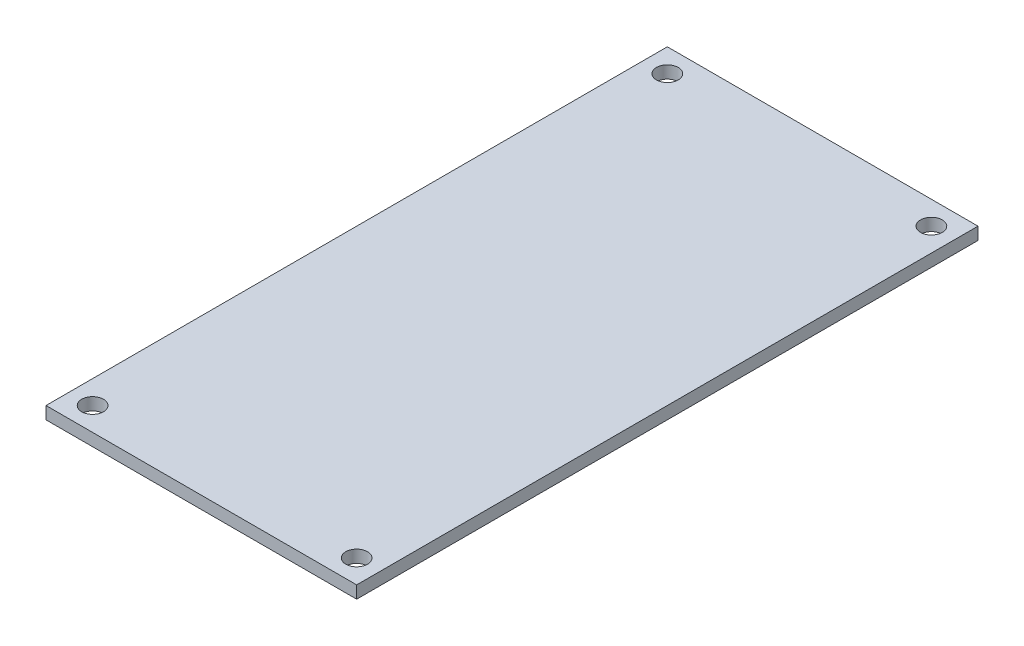
ISO-10303-21;
HEADER;
FILE_DESCRIPTION(('STEP AP214'),'2;1');
FILE_NAME('part.step','',(''),(''),'','','');
FILE_SCHEMA(('AUTOMOTIVE_DESIGN { 1 0 10303 214 1 1 1 1 }'));
ENDSEC;
DATA;
#1=APPLICATION_CONTEXT('core data for automotive mechanical design processes');
#2=APPLICATION_PROTOCOL_DEFINITION('international standard','automotive_design',2000,#1);
#3=PRODUCT_CONTEXT('',#1,'mechanical');
#4=PRODUCT('Part','Part','',(#3));
#5=PRODUCT_RELATED_PRODUCT_CATEGORY('part','',(#4));
#6=PRODUCT_DEFINITION_FORMATION('','',#4);
#7=PRODUCT_DEFINITION_CONTEXT('part definition',#1,'design');
#8=PRODUCT_DEFINITION('design','',#6,#7);
#9=PRODUCT_DEFINITION_SHAPE('','',#8);
#10=(LENGTH_UNIT() NAMED_UNIT(*) SI_UNIT(.MILLI.,.METRE.));
#11=(NAMED_UNIT(*) PLANE_ANGLE_UNIT() SI_UNIT($,.RADIAN.));
#12=(NAMED_UNIT(*) SI_UNIT($,.STERADIAN.) SOLID_ANGLE_UNIT());
#13=UNCERTAINTY_MEASURE_WITH_UNIT(LENGTH_MEASURE(1.E-05),#10,'distance_accuracy_value','');
#14=(GEOMETRIC_REPRESENTATION_CONTEXT(3) GLOBAL_UNCERTAINTY_ASSIGNED_CONTEXT((#13)) GLOBAL_UNIT_ASSIGNED_CONTEXT((#10,
#11,#12)) REPRESENTATION_CONTEXT('',''));
#15=CARTESIAN_POINT('',(0.,0.,0.));
#16=DIRECTION('',(0.,0.,1.));
#17=DIRECTION('',(1.,0.,0.));
#18=AXIS2_PLACEMENT_3D('',#15,#16,#17);
#19=CARTESIAN_POINT('',(0.,2.,0.));
#20=DIRECTION('',(0.,1.,0.));
#21=DIRECTION('',(0.,0.,1.));
#22=AXIS2_PLACEMENT_3D('',#19,#20,#21);
#23=PLANE('',#22);
#24=CARTESIAN_POINT('',(21.25,2.,46.25));
#25=DIRECTION('',(0.,1.,0.));
#26=DIRECTION('',(0.,0.,1.));
#27=AXIS2_PLACEMENT_3D('',#24,#25,#26);
#28=CIRCLE('',#27,1.75);
#29=CARTESIAN_POINT('',(21.25,2.,48.));
#30=VERTEX_POINT('',#29);
#31=EDGE_CURVE('E121',#30,#30,#28,.T.);
#32=ORIENTED_EDGE('',*,*,#31,.F.);
#33=EDGE_LOOP('',(#32));
#34=FACE_BOUND('',#33,.T.);
#35=CARTESIAN_POINT('',(-21.25,2.,-46.25));
#36=DIRECTION('',(0.,1.,0.));
#37=DIRECTION('',(0.,0.,1.));
#38=AXIS2_PLACEMENT_3D('',#35,#36,#37);
#39=CIRCLE('',#38,1.75);
#40=CARTESIAN_POINT('',(-21.25,2.,-44.5));
#41=VERTEX_POINT('',#40);
#42=EDGE_CURVE('E100',#41,#41,#39,.T.);
#43=ORIENTED_EDGE('',*,*,#42,.F.);
#44=EDGE_LOOP('',(#43));
#45=FACE_BOUND('',#44,.T.);
#46=DIRECTION('',(0.,0.,1.));
#47=VECTOR('',#46,1.);
#48=CARTESIAN_POINT('',(-25.,2.,50.));
#49=LINE('',#48,#47);
#50=CARTESIAN_POINT('',(-25.,2.,-50.));
#51=VERTEX_POINT('',#50);
#52=CARTESIAN_POINT('',(-25.,2.,50.));
#53=VERTEX_POINT('',#52);
#54=EDGE_CURVE('E85',#51,#53,#49,.T.);
#55=ORIENTED_EDGE('',*,*,#54,.T.);
#56=DIRECTION('',(1.,0.,0.));
#57=VECTOR('',#56,1.);
#58=CARTESIAN_POINT('',(25.,2.,50.));
#59=LINE('',#58,#57);
#60=CARTESIAN_POINT('',(25.,2.,50.));
#61=VERTEX_POINT('',#60);
#62=EDGE_CURVE('E80',#53,#61,#59,.T.);
#63=ORIENTED_EDGE('',*,*,#62,.T.);
#64=DIRECTION('',(0.,0.,-1.));
#65=VECTOR('',#64,1.);
#66=CARTESIAN_POINT('',(25.,2.,50.));
#67=LINE('',#66,#65);
#68=CARTESIAN_POINT('',(25.,2.,-50.));
#69=VERTEX_POINT('',#68);
#70=EDGE_CURVE('E83',#61,#69,#67,.T.);
#71=ORIENTED_EDGE('',*,*,#70,.T.);
#72=DIRECTION('',(-1.,0.,0.));
#73=VECTOR('',#72,1.);
#74=CARTESIAN_POINT('',(25.,2.,-50.));
#75=LINE('',#74,#73);
#76=EDGE_CURVE('E50',#69,#51,#75,.T.);
#77=ORIENTED_EDGE('',*,*,#76,.T.);
#78=EDGE_LOOP('',(#55,#63,#71,#77));
#79=FACE_BOUND('',#78,.T.);
#80=CARTESIAN_POINT('',(21.25,2.,-46.25));
#81=DIRECTION('',(0.,1.,0.));
#82=DIRECTION('',(0.,0.,-1.));
#83=AXIS2_PLACEMENT_3D('',#80,#81,#82);
#84=CIRCLE('',#83,1.75);
#85=CARTESIAN_POINT('',(21.25,2.,-48.));
#86=VERTEX_POINT('',#85);
#87=EDGE_CURVE('E115',#86,#86,#84,.T.);
#88=ORIENTED_EDGE('',*,*,#87,.F.);
#89=EDGE_LOOP('',(#88));
#90=FACE_BOUND('',#89,.T.);
#91=CARTESIAN_POINT('',(-21.25,2.,46.25));
#92=DIRECTION('',(0.,1.,0.));
#93=DIRECTION('',(0.,0.,-1.));
#94=AXIS2_PLACEMENT_3D('',#91,#92,#93);
#95=CIRCLE('',#94,1.75);
#96=CARTESIAN_POINT('',(-21.25,2.,44.5));
#97=VERTEX_POINT('',#96);
#98=EDGE_CURVE('E127',#97,#97,#95,.T.);
#99=ORIENTED_EDGE('',*,*,#98,.F.);
#100=EDGE_LOOP('',(#99));
#101=FACE_BOUND('',#100,.T.);
#102=ADVANCED_FACE('F33',(#34,#45,#79,#90,#101),#23,.T.);
#103=CARTESIAN_POINT('',(0.,0.,0.));
#104=DIRECTION('',(0.,1.,0.));
#105=DIRECTION('',(0.,0.,1.));
#106=AXIS2_PLACEMENT_3D('',#103,#104,#105);
#107=PLANE('',#106);
#108=DIRECTION('',(0.,0.,1.));
#109=VECTOR('',#108,1.);
#110=CARTESIAN_POINT('',(-25.,0.,50.));
#111=LINE('',#110,#109);
#112=CARTESIAN_POINT('',(-25.,0.,-50.));
#113=VERTEX_POINT('',#112);
#114=CARTESIAN_POINT('',(-25.,0.,50.));
#115=VERTEX_POINT('',#114);
#116=EDGE_CURVE('E97',#113,#115,#111,.T.);
#117=ORIENTED_EDGE('',*,*,#116,.F.);
#118=DIRECTION('',(-1.,0.,0.));
#119=VECTOR('',#118,1.);
#120=CARTESIAN_POINT('',(25.,0.,-50.));
#121=LINE('',#120,#119);
#122=CARTESIAN_POINT('',(25.,0.,-50.));
#123=VERTEX_POINT('',#122);
#124=EDGE_CURVE('E73',#123,#113,#121,.T.);
#125=ORIENTED_EDGE('',*,*,#124,.F.);
#126=DIRECTION('',(0.,0.,-1.));
#127=VECTOR('',#126,1.);
#128=CARTESIAN_POINT('',(25.,0.,50.));
#129=LINE('',#128,#127);
#130=CARTESIAN_POINT('',(25.,0.,50.));
#131=VERTEX_POINT('',#130);
#132=EDGE_CURVE('E67',#131,#123,#129,.T.);
#133=ORIENTED_EDGE('',*,*,#132,.F.);
#134=DIRECTION('',(1.,0.,0.));
#135=VECTOR('',#134,1.);
#136=CARTESIAN_POINT('',(25.,0.,50.));
#137=LINE('',#136,#135);
#138=EDGE_CURVE('E89',#115,#131,#137,.T.);
#139=ORIENTED_EDGE('',*,*,#138,.F.);
#140=EDGE_LOOP('',(#117,#125,#133,#139));
#141=FACE_BOUND('',#140,.T.);
#142=CARTESIAN_POINT('',(-21.25,0.,-46.25));
#143=DIRECTION('',(0.,1.,0.));
#144=DIRECTION('',(0.,0.,1.));
#145=AXIS2_PLACEMENT_3D('',#142,#143,#144);
#146=CIRCLE('',#145,1.75);
#147=CARTESIAN_POINT('',(-21.25,0.,-44.5));
#148=VERTEX_POINT('',#147);
#149=EDGE_CURVE('E112',#148,#148,#146,.T.);
#150=ORIENTED_EDGE('',*,*,#149,.T.);
#151=EDGE_LOOP('',(#150));
#152=FACE_BOUND('',#151,.T.);
#153=CARTESIAN_POINT('',(21.25,0.,-46.25));
#154=DIRECTION('',(0.,1.,0.));
#155=DIRECTION('',(0.,0.,-1.));
#156=AXIS2_PLACEMENT_3D('',#153,#154,#155);
#157=CIRCLE('',#156,1.75);
#158=CARTESIAN_POINT('',(21.25,0.,-48.));
#159=VERTEX_POINT('',#158);
#160=EDGE_CURVE('E118',#159,#159,#157,.T.);
#161=ORIENTED_EDGE('',*,*,#160,.T.);
#162=EDGE_LOOP('',(#161));
#163=FACE_BOUND('',#162,.T.);
#164=CARTESIAN_POINT('',(21.25,0.,46.25));
#165=DIRECTION('',(0.,1.,0.));
#166=DIRECTION('',(0.,0.,1.));
#167=AXIS2_PLACEMENT_3D('',#164,#165,#166);
#168=CIRCLE('',#167,1.75);
#169=CARTESIAN_POINT('',(21.25,0.,48.));
#170=VERTEX_POINT('',#169);
#171=EDGE_CURVE('E124',#170,#170,#168,.T.);
#172=ORIENTED_EDGE('',*,*,#171,.T.);
#173=EDGE_LOOP('',(#172));
#174=FACE_BOUND('',#173,.T.);
#175=CARTESIAN_POINT('',(-21.25,0.,46.25));
#176=DIRECTION('',(0.,1.,0.));
#177=DIRECTION('',(0.,0.,-1.));
#178=AXIS2_PLACEMENT_3D('',#175,#176,#177);
#179=CIRCLE('',#178,1.75);
#180=CARTESIAN_POINT('',(-21.25,0.,44.5));
#181=VERTEX_POINT('',#180);
#182=EDGE_CURVE('E130',#181,#181,#179,.T.);
#183=ORIENTED_EDGE('',*,*,#182,.T.);
#184=EDGE_LOOP('',(#183));
#185=FACE_BOUND('',#184,.T.);
#186=ADVANCED_FACE('F108',(#141,#152,#163,#174,#185),#107,.F.);
#187=CARTESIAN_POINT('',(-25.,2.,50.));
#188=DIRECTION('',(1.,0.,0.));
#189=DIRECTION('',(0.,0.,-1.));
#190=AXIS2_PLACEMENT_3D('',#187,#188,#189);
#191=PLANE('',#190);
#192=ORIENTED_EDGE('',*,*,#116,.T.);
#193=DIRECTION('',(0.,-1.,0.));
#194=VECTOR('',#193,1.);
#195=CARTESIAN_POINT('',(-25.,2.,50.));
#196=LINE('',#195,#194);
#197=EDGE_CURVE('E11',#53,#115,#196,.T.);
#198=ORIENTED_EDGE('',*,*,#197,.F.);
#199=ORIENTED_EDGE('',*,*,#54,.F.);
#200=DIRECTION('',(0.,-1.,0.));
#201=VECTOR('',#200,1.);
#202=CARTESIAN_POINT('',(-25.,2.,-50.));
#203=LINE('',#202,#201);
#204=EDGE_CURVE('E93',#51,#113,#203,.T.);
#205=ORIENTED_EDGE('',*,*,#204,.T.);
#206=EDGE_LOOP('',(#192,#198,#199,#205));
#207=FACE_BOUND('',#206,.T.);
#208=ADVANCED_FACE('F35',(#207),#191,.F.);
#209=CARTESIAN_POINT('',(25.,2.,50.));
#210=DIRECTION('',(0.,0.,-1.));
#211=DIRECTION('',(-1.,0.,0.));
#212=AXIS2_PLACEMENT_3D('',#209,#210,#211);
#213=PLANE('',#212);
#214=ORIENTED_EDGE('',*,*,#138,.T.);
#215=DIRECTION('',(0.,-1.,0.));
#216=VECTOR('',#215,1.);
#217=CARTESIAN_POINT('',(25.,2.,50.));
#218=LINE('',#217,#216);
#219=EDGE_CURVE('E42',#61,#131,#218,.T.);
#220=ORIENTED_EDGE('',*,*,#219,.F.);
#221=ORIENTED_EDGE('',*,*,#62,.F.);
#222=ORIENTED_EDGE('',*,*,#197,.T.);
#223=EDGE_LOOP('',(#214,#220,#221,#222));
#224=FACE_BOUND('',#223,.T.);
#225=ADVANCED_FACE('F88',(#224),#213,.F.);
#226=CARTESIAN_POINT('',(25.,2.,50.));
#227=DIRECTION('',(-1.,0.,0.));
#228=DIRECTION('',(0.,0.,1.));
#229=AXIS2_PLACEMENT_3D('',#226,#227,#228);
#230=PLANE('',#229);
#231=ORIENTED_EDGE('',*,*,#132,.T.);
#232=DIRECTION('',(0.,-1.,0.));
#233=VECTOR('',#232,1.);
#234=CARTESIAN_POINT('',(25.,2.,-50.));
#235=LINE('',#234,#233);
#236=EDGE_CURVE('E90',#69,#123,#235,.T.);
#237=ORIENTED_EDGE('',*,*,#236,.F.);
#238=ORIENTED_EDGE('',*,*,#70,.F.);
#239=ORIENTED_EDGE('',*,*,#219,.T.);
#240=EDGE_LOOP('',(#231,#237,#238,#239));
#241=FACE_BOUND('',#240,.T.);
#242=ADVANCED_FACE('F91',(#241),#230,.F.);
#243=CARTESIAN_POINT('',(25.,2.,-50.));
#244=DIRECTION('',(0.,0.,1.));
#245=DIRECTION('',(1.,0.,0.));
#246=AXIS2_PLACEMENT_3D('',#243,#244,#245);
#247=PLANE('',#246);
#248=ORIENTED_EDGE('',*,*,#124,.T.);
#249=ORIENTED_EDGE('',*,*,#204,.F.);
#250=ORIENTED_EDGE('',*,*,#76,.F.);
#251=ORIENTED_EDGE('',*,*,#236,.T.);
#252=EDGE_LOOP('',(#248,#249,#250,#251));
#253=FACE_BOUND('',#252,.T.);
#254=ADVANCED_FACE('F105',(#253),#247,.F.);
#255=CARTESIAN_POINT('',(-21.25,2.,-46.25));
#256=DIRECTION('',(0.,-1.,0.));
#257=DIRECTION('',(0.,0.,-1.));
#258=AXIS2_PLACEMENT_3D('',#255,#256,#257);
#259=CYLINDRICAL_SURFACE('',#258,1.75);
#260=ORIENTED_EDGE('',*,*,#42,.T.);
#261=EDGE_LOOP('',(#260));
#262=FACE_BOUND('',#261,.T.);
#263=ORIENTED_EDGE('',*,*,#149,.F.);
#264=EDGE_LOOP('',(#263));
#265=FACE_BOUND('',#264,.T.);
#266=ADVANCED_FACE('F149',(#262,#265),#259,.F.);
#267=CARTESIAN_POINT('',(21.25,2.,-46.25));
#268=DIRECTION('',(0.,-1.,0.));
#269=DIRECTION('',(0.,0.,-1.));
#270=AXIS2_PLACEMENT_3D('',#267,#268,#269);
#271=CYLINDRICAL_SURFACE('',#270,1.75);
#272=ORIENTED_EDGE('',*,*,#87,.T.);
#273=EDGE_LOOP('',(#272));
#274=FACE_BOUND('',#273,.T.);
#275=ORIENTED_EDGE('',*,*,#160,.F.);
#276=EDGE_LOOP('',(#275));
#277=FACE_BOUND('',#276,.T.);
#278=ADVANCED_FACE('F195',(#274,#277),#271,.F.);
#279=CARTESIAN_POINT('',(21.25,2.,46.25));
#280=DIRECTION('',(0.,-1.,0.));
#281=DIRECTION('',(0.,0.,-1.));
#282=AXIS2_PLACEMENT_3D('',#279,#280,#281);
#283=CYLINDRICAL_SURFACE('',#282,1.75);
#284=ORIENTED_EDGE('',*,*,#31,.T.);
#285=EDGE_LOOP('',(#284));
#286=FACE_BOUND('',#285,.T.);
#287=ORIENTED_EDGE('',*,*,#171,.F.);
#288=EDGE_LOOP('',(#287));
#289=FACE_BOUND('',#288,.T.);
#290=ADVANCED_FACE('F203',(#286,#289),#283,.F.);
#291=CARTESIAN_POINT('',(-21.25,2.,46.25));
#292=DIRECTION('',(0.,-1.,0.));
#293=DIRECTION('',(0.,0.,-1.));
#294=AXIS2_PLACEMENT_3D('',#291,#292,#293);
#295=CYLINDRICAL_SURFACE('',#294,1.75);
#296=ORIENTED_EDGE('',*,*,#98,.T.);
#297=EDGE_LOOP('',(#296));
#298=FACE_BOUND('',#297,.T.);
#299=ORIENTED_EDGE('',*,*,#182,.F.);
#300=EDGE_LOOP('',(#299));
#301=FACE_BOUND('',#300,.T.);
#302=ADVANCED_FACE('F136',(#298,#301),#295,.F.);
#303=CLOSED_SHELL('',(#102,#186,#208,#225,#242,#254,#266,#278,#290,#302));
#304=MANIFOLD_SOLID_BREP('B2',#303);
#305=ADVANCED_BREP_SHAPE_REPRESENTATION('',(#18,#304),#14);
#306=SHAPE_DEFINITION_REPRESENTATION(#9,#305);
ENDSEC;
END-ISO-10303-21;
